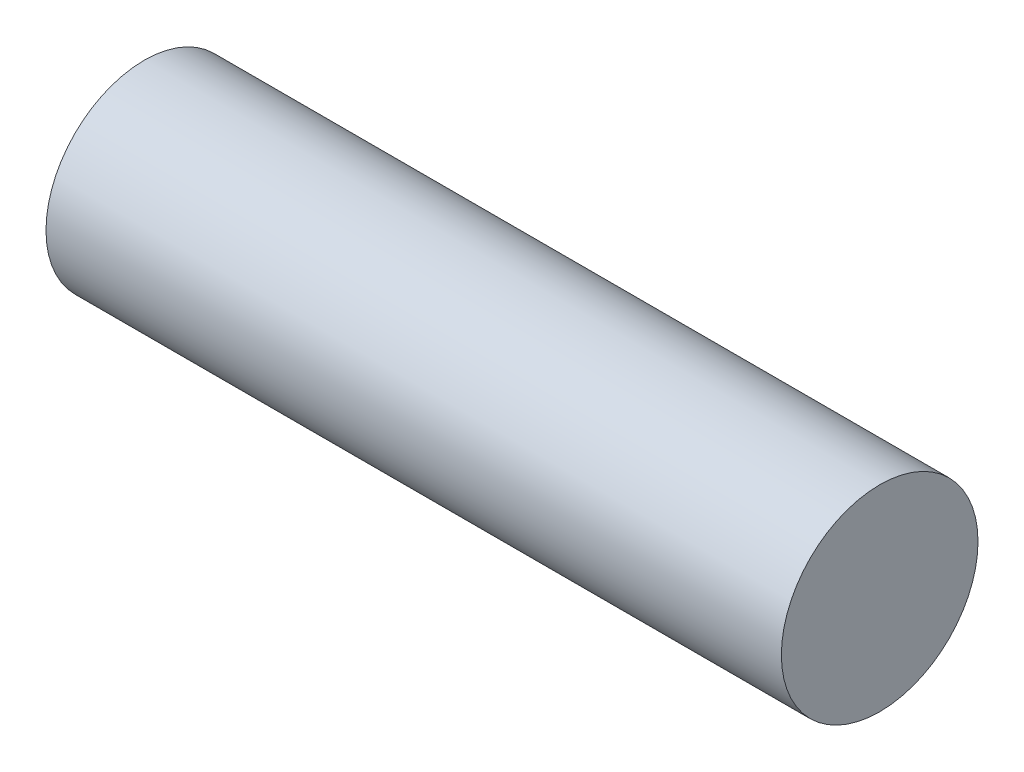
ISO-10303-21;
HEADER;
FILE_DESCRIPTION(('STEP AP214'),'2;1');
FILE_NAME('part.step','',(''),(''),'','','');
FILE_SCHEMA(('AUTOMOTIVE_DESIGN { 1 0 10303 214 1 1 1 1 }'));
ENDSEC;
DATA;
#1=APPLICATION_CONTEXT('core data for automotive mechanical design processes');
#2=APPLICATION_PROTOCOL_DEFINITION('international standard','automotive_design',2000,#1);
#3=PRODUCT_CONTEXT('',#1,'mechanical');
#4=PRODUCT('Part','Part','',(#3));
#5=PRODUCT_RELATED_PRODUCT_CATEGORY('part','',(#4));
#6=PRODUCT_DEFINITION_FORMATION('','',#4);
#7=PRODUCT_DEFINITION_CONTEXT('part definition',#1,'design');
#8=PRODUCT_DEFINITION('design','',#6,#7);
#9=PRODUCT_DEFINITION_SHAPE('','',#8);
#10=(LENGTH_UNIT() NAMED_UNIT(*) SI_UNIT(.MILLI.,.METRE.));
#11=(NAMED_UNIT(*) PLANE_ANGLE_UNIT() SI_UNIT($,.RADIAN.));
#12=(NAMED_UNIT(*) SI_UNIT($,.STERADIAN.) SOLID_ANGLE_UNIT());
#13=UNCERTAINTY_MEASURE_WITH_UNIT(LENGTH_MEASURE(1.E-05),#10,'distance_accuracy_value','');
#14=(GEOMETRIC_REPRESENTATION_CONTEXT(3) GLOBAL_UNCERTAINTY_ASSIGNED_CONTEXT((#13)) GLOBAL_UNIT_ASSIGNED_CONTEXT((#10,
#11,#12)) REPRESENTATION_CONTEXT('',''));
#15=CARTESIAN_POINT('',(0.,0.,0.));
#16=DIRECTION('',(0.,0.,1.));
#17=DIRECTION('',(1.,0.,0.));
#18=AXIS2_PLACEMENT_3D('',#15,#16,#17);
#19=CARTESIAN_POINT('',(29.92,0.,0.));
#20=DIRECTION('',(-1.,0.,0.));
#21=DIRECTION('',(0.,0.,1.));
#22=AXIS2_PLACEMENT_3D('',#19,#20,#21);
#23=CYLINDRICAL_SURFACE('',#22,4.);
#24=CARTESIAN_POINT('',(29.92,0.,0.));
#25=DIRECTION('',(1.,0.,0.));
#26=DIRECTION('',(0.,0.,-1.));
#27=AXIS2_PLACEMENT_3D('',#24,#25,#26);
#28=CIRCLE('',#27,4.);
#29=CARTESIAN_POINT('',(29.92,0.,-4.));
#30=VERTEX_POINT('',#29);
#31=EDGE_CURVE('E10',#30,#30,#28,.T.);
#32=ORIENTED_EDGE('',*,*,#31,.F.);
#33=EDGE_LOOP('',(#32));
#34=FACE_BOUND('',#33,.T.);
#35=CARTESIAN_POINT('',(0.,0.,0.));
#36=DIRECTION('',(1.,0.,0.));
#37=DIRECTION('',(0.,0.,-1.));
#38=AXIS2_PLACEMENT_3D('',#35,#36,#37);
#39=CIRCLE('',#38,4.);
#40=CARTESIAN_POINT('',(0.,0.,-4.));
#41=VERTEX_POINT('',#40);
#42=EDGE_CURVE('E42',#41,#41,#39,.T.);
#43=ORIENTED_EDGE('',*,*,#42,.T.);
#44=EDGE_LOOP('',(#43));
#45=FACE_BOUND('',#44,.T.);
#46=ADVANCED_FACE('F39',(#34,#45),#23,.T.);
#47=CARTESIAN_POINT('',(29.92,0.,0.));
#48=DIRECTION('',(1.,0.,0.));
#49=DIRECTION('',(0.,0.,-1.));
#50=AXIS2_PLACEMENT_3D('',#47,#48,#49);
#51=PLANE('',#50);
#52=ORIENTED_EDGE('',*,*,#31,.T.);
#53=EDGE_LOOP('',(#52));
#54=FACE_BOUND('',#53,.T.);
#55=ADVANCED_FACE('F54',(#54),#51,.T.);
#56=CARTESIAN_POINT('',(0.,0.,0.));
#57=DIRECTION('',(1.,0.,0.));
#58=DIRECTION('',(0.,0.,-1.));
#59=AXIS2_PLACEMENT_3D('',#56,#57,#58);
#60=PLANE('',#59);
#61=ORIENTED_EDGE('',*,*,#42,.F.);
#62=EDGE_LOOP('',(#61));
#63=FACE_BOUND('',#62,.T.);
#64=ADVANCED_FACE('F52',(#63),#60,.F.);
#65=CLOSED_SHELL('',(#46,#55,#64));
#66=MANIFOLD_SOLID_BREP('B2',#65);
#67=ADVANCED_BREP_SHAPE_REPRESENTATION('',(#18,#66),#14);
#68=SHAPE_DEFINITION_REPRESENTATION(#9,#67);
ENDSEC;
END-ISO-10303-21;
